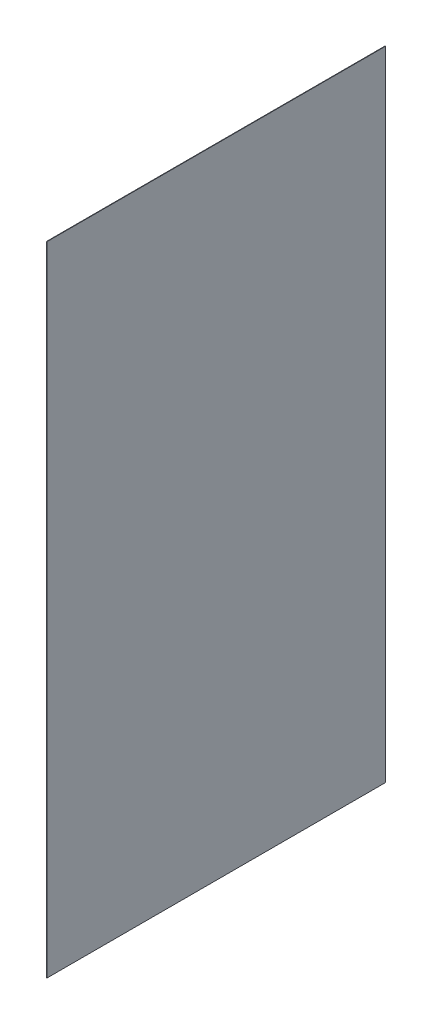
ISO-10303-21;
HEADER;
FILE_DESCRIPTION(('STEP AP214'),'2;1');
FILE_NAME('part.step','',(''),(''),'','','');
FILE_SCHEMA(('AUTOMOTIVE_DESIGN { 1 0 10303 214 1 1 1 1 }'));
ENDSEC;
DATA;
#1=APPLICATION_CONTEXT('core data for automotive mechanical design processes');
#2=APPLICATION_PROTOCOL_DEFINITION('international standard','automotive_design',2000,#1);
#3=PRODUCT_CONTEXT('',#1,'mechanical');
#4=PRODUCT('Part','Part','',(#3));
#5=PRODUCT_RELATED_PRODUCT_CATEGORY('part','',(#4));
#6=PRODUCT_DEFINITION_FORMATION('','',#4);
#7=PRODUCT_DEFINITION_CONTEXT('part definition',#1,'design');
#8=PRODUCT_DEFINITION('design','',#6,#7);
#9=PRODUCT_DEFINITION_SHAPE('','',#8);
#10=(LENGTH_UNIT() NAMED_UNIT(*) SI_UNIT(.MILLI.,.METRE.));
#11=(NAMED_UNIT(*) PLANE_ANGLE_UNIT() SI_UNIT($,.RADIAN.));
#12=(NAMED_UNIT(*) SI_UNIT($,.STERADIAN.) SOLID_ANGLE_UNIT());
#13=UNCERTAINTY_MEASURE_WITH_UNIT(LENGTH_MEASURE(1.E-05),#10,'distance_accuracy_value','');
#14=(GEOMETRIC_REPRESENTATION_CONTEXT(3) GLOBAL_UNCERTAINTY_ASSIGNED_CONTEXT((#13)) GLOBAL_UNIT_ASSIGNED_CONTEXT((#10,
#11,#12)) REPRESENTATION_CONTEXT('',''));
#15=CARTESIAN_POINT('',(0.,0.,0.));
#16=DIRECTION('',(0.,0.,1.));
#17=DIRECTION('',(1.,0.,0.));
#18=AXIS2_PLACEMENT_3D('',#15,#16,#17);
#19=CARTESIAN_POINT('',(713.,182.5,-757.5));
#20=DIRECTION('',(-1.,0.,0.));
#21=DIRECTION('',(0.,0.,1.));
#22=AXIS2_PLACEMENT_3D('',#19,#20,#21);
#23=PLANE('',#22);
#24=DIRECTION('',(0.,-1.,0.));
#25=VECTOR('',#24,1.);
#26=CARTESIAN_POINT('',(713.,182.5,0.));
#27=LINE('',#26,#25);
#28=CARTESIAN_POINT('',(713.,1610.,0.));
#29=VERTEX_POINT('',#28);
#30=CARTESIAN_POINT('',(713.,182.5,0.));
#31=VERTEX_POINT('',#30);
#32=EDGE_CURVE('E103',#29,#31,#27,.T.);
#33=ORIENTED_EDGE('',*,*,#32,.F.);
#34=DIRECTION('',(0.,0.,1.));
#35=VECTOR('',#34,1.);
#36=CARTESIAN_POINT('',(713.,1610.,-757.5));
#37=LINE('',#36,#35);
#38=CARTESIAN_POINT('',(713.,1610.,-757.5));
#39=VERTEX_POINT('',#38);
#40=EDGE_CURVE('E11',#39,#29,#37,.T.);
#41=ORIENTED_EDGE('',*,*,#40,.F.);
#42=DIRECTION('',(0.,-1.,0.));
#43=VECTOR('',#42,1.);
#44=CARTESIAN_POINT('',(713.,182.5,-757.5));
#45=LINE('',#44,#43);
#46=CARTESIAN_POINT('',(713.,182.5,-757.5));
#47=VERTEX_POINT('',#46);
#48=EDGE_CURVE('E97',#39,#47,#45,.T.);
#49=ORIENTED_EDGE('',*,*,#48,.T.);
#50=DIRECTION('',(0.,0.,1.));
#51=VECTOR('',#50,1.);
#52=CARTESIAN_POINT('',(713.,182.5,-757.5));
#53=LINE('',#52,#51);
#54=EDGE_CURVE('E42',#47,#31,#53,.T.);
#55=ORIENTED_EDGE('',*,*,#54,.T.);
#56=EDGE_LOOP('',(#33,#41,#49,#55));
#57=FACE_BOUND('',#56,.T.);
#58=ADVANCED_FACE('F39',(#57),#23,.T.);
#59=CARTESIAN_POINT('',(713.,1610.,-757.5));
#60=DIRECTION('',(0.,1.,0.));
#61=DIRECTION('',(0.,0.,1.));
#62=AXIS2_PLACEMENT_3D('',#59,#60,#61);
#63=PLANE('',#62);
#64=DIRECTION('',(-1.,0.,0.));
#65=VECTOR('',#64,1.);
#66=CARTESIAN_POINT('',(713.,1610.,0.));
#67=LINE('',#66,#65);
#68=CARTESIAN_POINT('',(714.,1610.,0.));
#69=VERTEX_POINT('',#68);
#70=EDGE_CURVE('E99',#69,#29,#67,.T.);
#71=ORIENTED_EDGE('',*,*,#70,.F.);
#72=DIRECTION('',(0.,0.,1.));
#73=VECTOR('',#72,1.);
#74=CARTESIAN_POINT('',(714.,1610.,-757.5));
#75=LINE('',#74,#73);
#76=CARTESIAN_POINT('',(714.,1610.,-757.5));
#77=VERTEX_POINT('',#76);
#78=EDGE_CURVE('E48',#77,#69,#75,.T.);
#79=ORIENTED_EDGE('',*,*,#78,.F.);
#80=DIRECTION('',(-1.,0.,0.));
#81=VECTOR('',#80,1.);
#82=CARTESIAN_POINT('',(713.,1610.,-757.5));
#83=LINE('',#82,#81);
#84=EDGE_CURVE('E94',#77,#39,#83,.T.);
#85=ORIENTED_EDGE('',*,*,#84,.T.);
#86=ORIENTED_EDGE('',*,*,#40,.T.);
#87=EDGE_LOOP('',(#71,#79,#85,#86));
#88=FACE_BOUND('',#87,.T.);
#89=ADVANCED_FACE('F113',(#88),#63,.T.);
#90=CARTESIAN_POINT('',(714.,182.5,-757.5));
#91=DIRECTION('',(1.,0.,0.));
#92=DIRECTION('',(0.,0.,-1.));
#93=AXIS2_PLACEMENT_3D('',#90,#91,#92);
#94=PLANE('',#93);
#95=DIRECTION('',(0.,1.,0.));
#96=VECTOR('',#95,1.);
#97=CARTESIAN_POINT('',(714.,182.5,0.));
#98=LINE('',#97,#96);
#99=CARTESIAN_POINT('',(714.,182.5,0.));
#100=VERTEX_POINT('',#99);
#101=EDGE_CURVE('E89',#100,#69,#98,.T.);
#102=ORIENTED_EDGE('',*,*,#101,.F.);
#103=DIRECTION('',(0.,0.,1.));
#104=VECTOR('',#103,1.);
#105=CARTESIAN_POINT('',(714.,182.5,-757.5));
#106=LINE('',#105,#104);
#107=CARTESIAN_POINT('',(714.,182.5,-757.5));
#108=VERTEX_POINT('',#107);
#109=EDGE_CURVE('E84',#108,#100,#106,.T.);
#110=ORIENTED_EDGE('',*,*,#109,.F.);
#111=DIRECTION('',(0.,1.,0.));
#112=VECTOR('',#111,1.);
#113=CARTESIAN_POINT('',(714.,182.5,-757.5));
#114=LINE('',#113,#112);
#115=EDGE_CURVE('E87',#108,#77,#114,.T.);
#116=ORIENTED_EDGE('',*,*,#115,.T.);
#117=ORIENTED_EDGE('',*,*,#78,.T.);
#118=EDGE_LOOP('',(#102,#110,#116,#117));
#119=FACE_BOUND('',#118,.T.);
#120=ADVANCED_FACE('F86',(#119),#94,.T.);
#121=CARTESIAN_POINT('',(713.,182.5,-757.5));
#122=DIRECTION('',(0.,-1.,0.));
#123=DIRECTION('',(0.,0.,-1.));
#124=AXIS2_PLACEMENT_3D('',#121,#122,#123);
#125=PLANE('',#124);
#126=DIRECTION('',(1.,0.,0.));
#127=VECTOR('',#126,1.);
#128=CARTESIAN_POINT('',(713.,182.5,0.));
#129=LINE('',#128,#127);
#130=EDGE_CURVE('E106',#31,#100,#129,.T.);
#131=ORIENTED_EDGE('',*,*,#130,.F.);
#132=ORIENTED_EDGE('',*,*,#54,.F.);
#133=DIRECTION('',(1.,0.,0.));
#134=VECTOR('',#133,1.);
#135=CARTESIAN_POINT('',(713.,182.5,-757.5));
#136=LINE('',#135,#134);
#137=EDGE_CURVE('E93',#47,#108,#136,.T.);
#138=ORIENTED_EDGE('',*,*,#137,.T.);
#139=ORIENTED_EDGE('',*,*,#109,.T.);
#140=EDGE_LOOP('',(#131,#132,#138,#139));
#141=FACE_BOUND('',#140,.T.);
#142=ADVANCED_FACE('F96',(#141),#125,.T.);
#143=CARTESIAN_POINT('',(0.,0.,-757.5));
#144=DIRECTION('',(0.,0.,-1.));
#145=DIRECTION('',(-1.,0.,0.));
#146=AXIS2_PLACEMENT_3D('',#143,#144,#145);
#147=PLANE('',#146);
#148=ORIENTED_EDGE('',*,*,#48,.F.);
#149=ORIENTED_EDGE('',*,*,#84,.F.);
#150=ORIENTED_EDGE('',*,*,#115,.F.);
#151=ORIENTED_EDGE('',*,*,#137,.F.);
#152=EDGE_LOOP('',(#148,#149,#150,#151));
#153=FACE_BOUND('',#152,.T.);
#154=ADVANCED_FACE('F92',(#153),#147,.T.);
#155=CARTESIAN_POINT('',(0.,0.,0.));
#156=DIRECTION('',(0.,0.,-1.));
#157=DIRECTION('',(-1.,0.,0.));
#158=AXIS2_PLACEMENT_3D('',#155,#156,#157);
#159=PLANE('',#158);
#160=ORIENTED_EDGE('',*,*,#32,.T.);
#161=ORIENTED_EDGE('',*,*,#130,.T.);
#162=ORIENTED_EDGE('',*,*,#101,.T.);
#163=ORIENTED_EDGE('',*,*,#70,.T.);
#164=EDGE_LOOP('',(#160,#161,#162,#163));
#165=FACE_BOUND('',#164,.T.);
#166=ADVANCED_FACE('F112',(#165),#159,.F.);
#167=CLOSED_SHELL('',(#58,#89,#120,#142,#154,#166));
#168=MANIFOLD_SOLID_BREP('B2',#167);
#169=ADVANCED_BREP_SHAPE_REPRESENTATION('',(#18,#168),#14);
#170=SHAPE_DEFINITION_REPRESENTATION(#9,#169);
ENDSEC;
END-ISO-10303-21;
